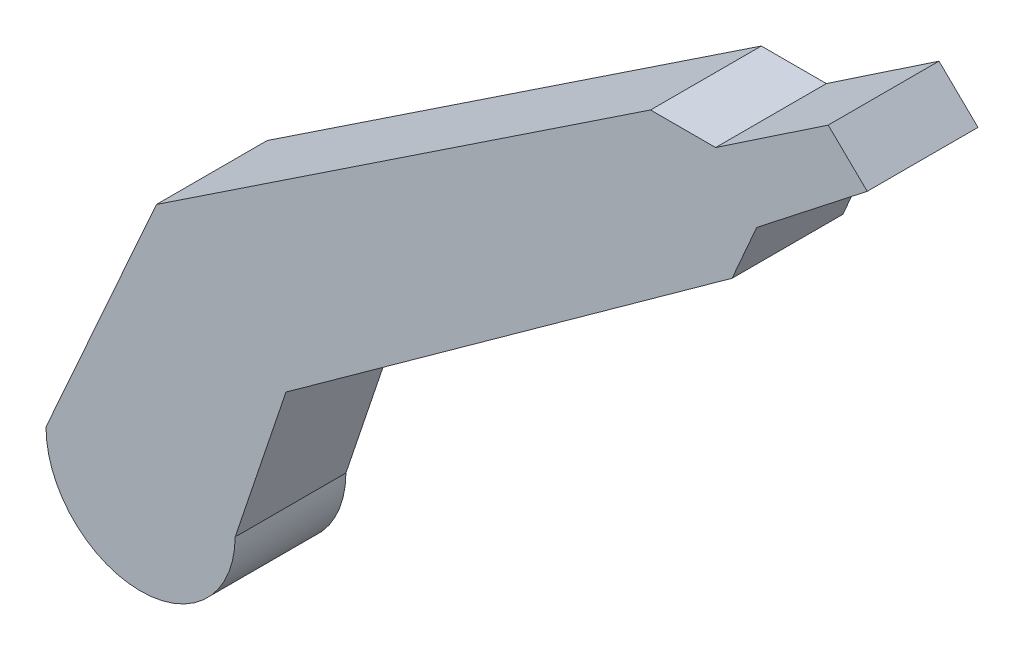
ISO-10303-21;
HEADER;
FILE_DESCRIPTION(('STEP AP214'),'2;1');
FILE_NAME('part.step','',(''),(''),'','','');
FILE_SCHEMA(('AUTOMOTIVE_DESIGN { 1 0 10303 214 1 1 1 1 }'));
ENDSEC;
DATA;
#1=APPLICATION_CONTEXT('core data for automotive mechanical design processes');
#2=APPLICATION_PROTOCOL_DEFINITION('international standard','automotive_design',2000,#1);
#3=PRODUCT_CONTEXT('',#1,'mechanical');
#4=PRODUCT('Part','Part','',(#3));
#5=PRODUCT_RELATED_PRODUCT_CATEGORY('part','',(#4));
#6=PRODUCT_DEFINITION_FORMATION('','',#4);
#7=PRODUCT_DEFINITION_CONTEXT('part definition',#1,'design');
#8=PRODUCT_DEFINITION('design','',#6,#7);
#9=PRODUCT_DEFINITION_SHAPE('','',#8);
#10=(LENGTH_UNIT() NAMED_UNIT(*) SI_UNIT(.MILLI.,.METRE.));
#11=(NAMED_UNIT(*) PLANE_ANGLE_UNIT() SI_UNIT($,.RADIAN.));
#12=(NAMED_UNIT(*) SI_UNIT($,.STERADIAN.) SOLID_ANGLE_UNIT());
#13=UNCERTAINTY_MEASURE_WITH_UNIT(LENGTH_MEASURE(1.E-05),#10,'distance_accuracy_value','');
#14=(GEOMETRIC_REPRESENTATION_CONTEXT(3) GLOBAL_UNCERTAINTY_ASSIGNED_CONTEXT((#13)) GLOBAL_UNIT_ASSIGNED_CONTEXT((#10,
#11,#12)) REPRESENTATION_CONTEXT('',''));
#15=CARTESIAN_POINT('',(0.,0.,0.));
#16=DIRECTION('',(0.,0.,1.));
#17=DIRECTION('',(1.,0.,0.));
#18=AXIS2_PLACEMENT_3D('',#15,#16,#17);
#19=CARTESIAN_POINT('',(-4.96700439876463,8.83577647212519,-15.));
#20=DIRECTION('',(0.,1.,0.));
#21=DIRECTION('',(0.,0.,1.));
#22=AXIS2_PLACEMENT_3D('',#19,#20,#21);
#23=PLANE('',#22);
#24=DIRECTION('',(-1.,0.,0.));
#25=VECTOR('',#24,1.);
#26=CARTESIAN_POINT('',(-4.96700439876463,8.83577647212519,0.));
#27=LINE('',#26,#25);
#28=CARTESIAN_POINT('',(3.84495684434683,8.83577647212519,0.));
#29=VERTEX_POINT('',#28);
#30=CARTESIAN_POINT('',(-4.96700439876463,8.83577647212519,0.));
#31=VERTEX_POINT('',#30);
#32=EDGE_CURVE('E152',#29,#31,#27,.T.);
#33=ORIENTED_EDGE('',*,*,#32,.F.);
#34=DIRECTION('',(0.,0.,1.));
#35=VECTOR('',#34,1.);
#36=CARTESIAN_POINT('',(3.84495684434683,8.83577647212519,-15.));
#37=LINE('',#36,#35);
#38=CARTESIAN_POINT('',(3.84495684434683,8.83577647212519,-15.));
#39=VERTEX_POINT('',#38);
#40=EDGE_CURVE('E11',#39,#29,#37,.T.);
#41=ORIENTED_EDGE('',*,*,#40,.F.);
#42=DIRECTION('',(-1.,0.,0.));
#43=VECTOR('',#42,1.);
#44=CARTESIAN_POINT('',(-4.96700439876463,8.83577647212519,-15.));
#45=LINE('',#44,#43);
#46=CARTESIAN_POINT('',(-4.96700439876463,8.83577647212519,-15.));
#47=VERTEX_POINT('',#46);
#48=EDGE_CURVE('E178',#39,#47,#45,.T.);
#49=ORIENTED_EDGE('',*,*,#48,.T.);
#50=DIRECTION('',(0.,0.,1.));
#51=VECTOR('',#50,1.);
#52=CARTESIAN_POINT('',(-4.96700439876463,8.83577647212519,-15.));
#53=LINE('',#52,#51);
#54=EDGE_CURVE('E46',#47,#31,#53,.T.);
#55=ORIENTED_EDGE('',*,*,#54,.T.);
#56=EDGE_LOOP('',(#33,#41,#49,#55));
#57=FACE_BOUND('',#56,.T.);
#58=ADVANCED_FACE('F43',(#57),#23,.T.);
#59=CARTESIAN_POINT('',(3.84495684434683,8.83577647212519,-15.));
#60=DIRECTION('',(-0.558142355295475,0.829745208618417,0.));
#61=DIRECTION('',(-0.829745208618417,-0.558142355295475,0.));
#62=AXIS2_PLACEMENT_3D('',#59,#60,#61);
#63=PLANE('',#62);
#64=DIRECTION('',(-0.829745208618417,-0.558142355295475,0.));
#65=VECTOR('',#64,1.);
#66=CARTESIAN_POINT('',(3.84495684434683,8.83577647212519,0.));
#67=LINE('',#66,#65);
#68=CARTESIAN_POINT('',(19.0918830920997,19.0918830920198,0.));
#69=VERTEX_POINT('',#68);
#70=EDGE_CURVE('E176',#69,#29,#67,.T.);
#71=ORIENTED_EDGE('',*,*,#70,.F.);
#72=DIRECTION('',(0.,0.,1.));
#73=VECTOR('',#72,1.);
#74=CARTESIAN_POINT('',(19.0918830920997,19.0918830920198,-15.));
#75=LINE('',#74,#73);
#76=CARTESIAN_POINT('',(19.0918830920997,19.0918830920198,-15.));
#77=VERTEX_POINT('',#76);
#78=EDGE_CURVE('E52',#77,#69,#75,.T.);
#79=ORIENTED_EDGE('',*,*,#78,.F.);
#80=DIRECTION('',(-0.829745208618417,-0.558142355295475,0.));
#81=VECTOR('',#80,1.);
#82=CARTESIAN_POINT('',(3.84495684434683,8.83577647212519,-15.));
#83=LINE('',#82,#81);
#84=EDGE_CURVE('E142',#77,#39,#83,.T.);
#85=ORIENTED_EDGE('',*,*,#84,.T.);
#86=ORIENTED_EDGE('',*,*,#40,.T.);
#87=EDGE_LOOP('',(#71,#79,#85,#86));
#88=FACE_BOUND('',#87,.T.);
#89=ADVANCED_FACE('F194',(#88),#63,.T.);
#90=CARTESIAN_POINT('',(19.0918830920997,19.0918830920198,-15.));
#91=DIRECTION('',(0.696355952916094,0.717696584106626,0.));
#92=DIRECTION('',(-0.717696584106626,0.696355952916094,0.));
#93=AXIS2_PLACEMENT_3D('',#90,#91,#92);
#94=PLANE('',#93);
#95=DIRECTION('',(-0.717696584106626,0.696355952916094,0.));
#96=VECTOR('',#95,1.);
#97=CARTESIAN_POINT('',(19.0918830920997,19.0918830920198,0.));
#98=LINE('',#97,#96);
#99=CARTESIAN_POINT('',(24.3770915092227,13.9638297820725,0.));
#100=VERTEX_POINT('',#99);
#101=EDGE_CURVE('E129',#100,#69,#98,.T.);
#102=ORIENTED_EDGE('',*,*,#101,.F.);
#103=DIRECTION('',(0.,0.,1.));
#104=VECTOR('',#103,1.);
#105=CARTESIAN_POINT('',(24.3770915092227,13.9638297820725,-15.));
#106=LINE('',#105,#104);
#107=CARTESIAN_POINT('',(24.3770915092227,13.9638297820725,-15.));
#108=VERTEX_POINT('',#107);
#109=EDGE_CURVE('E124',#108,#100,#106,.T.);
#110=ORIENTED_EDGE('',*,*,#109,.F.);
#111=DIRECTION('',(-0.717696584106626,0.696355952916094,0.));
#112=VECTOR('',#111,1.);
#113=CARTESIAN_POINT('',(19.0918830920997,19.0918830920198,-15.));
#114=LINE('',#113,#112);
#115=EDGE_CURVE('E127',#108,#77,#114,.T.);
#116=ORIENTED_EDGE('',*,*,#115,.T.);
#117=ORIENTED_EDGE('',*,*,#78,.T.);
#118=EDGE_LOOP('',(#102,#110,#116,#117));
#119=FACE_BOUND('',#118,.T.);
#120=ADVANCED_FACE('F126',(#119),#94,.T.);
#121=CARTESIAN_POINT('',(24.3770915092227,13.9638297820725,-15.));
#122=DIRECTION('',(0.616422868203892,-0.787415295479639,0.));
#123=DIRECTION('',(0.787415295479639,0.616422868203892,0.));
#124=AXIS2_PLACEMENT_3D('',#121,#122,#123);
#125=PLANE('',#124);
#126=DIRECTION('',(0.787415295479639,0.616422868203892,0.));
#127=VECTOR('',#126,1.);
#128=CARTESIAN_POINT('',(24.3770915092227,13.9638297820725,0.));
#129=LINE('',#128,#127);
#130=CARTESIAN_POINT('',(9.4079892103025,2.24536682293319,0.));
#131=VERTEX_POINT('',#130);
#132=EDGE_CURVE('E173',#131,#100,#129,.T.);
#133=ORIENTED_EDGE('',*,*,#132,.F.);
#134=DIRECTION('',(0.,0.,1.));
#135=VECTOR('',#134,1.);
#136=CARTESIAN_POINT('',(9.4079892103025,2.24536682293319,-15.));
#137=LINE('',#136,#135);
#138=CARTESIAN_POINT('',(9.4079892103025,2.24536682293319,-15.));
#139=VERTEX_POINT('',#138);
#140=EDGE_CURVE('E134',#139,#131,#137,.T.);
#141=ORIENTED_EDGE('',*,*,#140,.F.);
#142=DIRECTION('',(0.787415295479639,0.616422868203892,0.));
#143=VECTOR('',#142,1.);
#144=CARTESIAN_POINT('',(24.3770915092227,13.9638297820725,-15.));
#145=LINE('',#144,#143);
#146=EDGE_CURVE('E140',#139,#108,#145,.T.);
#147=ORIENTED_EDGE('',*,*,#146,.T.);
#148=ORIENTED_EDGE('',*,*,#109,.T.);
#149=EDGE_LOOP('',(#133,#141,#147,#148));
#150=FACE_BOUND('',#149,.T.);
#151=ADVANCED_FACE('F144',(#150),#125,.T.);
#152=CARTESIAN_POINT('',(9.4079892103025,2.24536682293319,-15.));
#153=DIRECTION('',(0.916458991132979,-0.400128626283502,0.));
#154=DIRECTION('',(0.400128626283502,0.916458991132979,0.));
#155=AXIS2_PLACEMENT_3D('',#152,#153,#154);
#156=PLANE('',#155);
#157=DIRECTION('',(0.400128626283502,0.916458991132979,0.));
#158=VECTOR('',#157,1.);
#159=CARTESIAN_POINT('',(9.4079892103025,2.24536682293319,0.));
#160=LINE('',#159,#158);
#161=CARTESIAN_POINT('',(6.0777600064057,-5.38222664567911,0.));
#162=VERTEX_POINT('',#161);
#163=EDGE_CURVE('E170',#162,#131,#160,.T.);
#164=ORIENTED_EDGE('',*,*,#163,.F.);
#165=DIRECTION('',(0.,0.,1.));
#166=VECTOR('',#165,1.);
#167=CARTESIAN_POINT('',(6.0777600064057,-5.38222664567911,-15.));
#168=LINE('',#167,#166);
#169=CARTESIAN_POINT('',(6.0777600064057,-5.38222664567911,-15.));
#170=VERTEX_POINT('',#169);
#171=EDGE_CURVE('E182',#170,#162,#168,.T.);
#172=ORIENTED_EDGE('',*,*,#171,.F.);
#173=DIRECTION('',(0.400128626283502,0.916458991132979,0.));
#174=VECTOR('',#173,1.);
#175=CARTESIAN_POINT('',(9.4079892103025,2.24536682293319,-15.));
#176=LINE('',#175,#174);
#177=EDGE_CURVE('E145',#170,#139,#176,.T.);
#178=ORIENTED_EDGE('',*,*,#177,.T.);
#179=ORIENTED_EDGE('',*,*,#140,.T.);
#180=EDGE_LOOP('',(#164,#172,#178,#179));
#181=FACE_BOUND('',#180,.T.);
#182=ADVANCED_FACE('F207',(#181),#156,.T.);
#183=CARTESIAN_POINT('',(6.0777600064057,-5.38222664567911,-15.));
#184=DIRECTION('',(0.584776246688422,-0.811194638363076,0.));
#185=DIRECTION('',(0.811194638363076,0.584776246688422,0.));
#186=AXIS2_PLACEMENT_3D('',#183,#184,#185);
#187=PLANE('',#186);
#188=DIRECTION('',(0.811194638363076,0.584776246688422,0.));
#189=VECTOR('',#188,1.);
#190=CARTESIAN_POINT('',(6.0777600064057,-5.38222664567911,0.));
#191=LINE('',#190,#189);
#192=CARTESIAN_POINT('',(-54.3403592021819,-48.9366084326035,0.));
#193=VERTEX_POINT('',#192);
#194=EDGE_CURVE('E167',#193,#162,#191,.T.);
#195=ORIENTED_EDGE('',*,*,#194,.F.);
#196=DIRECTION('',(0.,0.,1.));
#197=VECTOR('',#196,1.);
#198=CARTESIAN_POINT('',(-54.3403592021819,-48.9366084326035,-15.));
#199=LINE('',#198,#197);
#200=CARTESIAN_POINT('',(-54.3403592021819,-48.9366084326035,-15.));
#201=VERTEX_POINT('',#200);
#202=EDGE_CURVE('E184',#201,#193,#199,.T.);
#203=ORIENTED_EDGE('',*,*,#202,.F.);
#204=DIRECTION('',(0.811194638363076,0.584776246688422,0.));
#205=VECTOR('',#204,1.);
#206=CARTESIAN_POINT('',(6.0777600064057,-5.38222664567911,-15.));
#207=LINE('',#206,#205);
#208=EDGE_CURVE('E147',#201,#170,#207,.T.);
#209=ORIENTED_EDGE('',*,*,#208,.T.);
#210=ORIENTED_EDGE('',*,*,#171,.T.);
#211=EDGE_LOOP('',(#195,#203,#209,#210));
#212=FACE_BOUND('',#211,.T.);
#213=ADVANCED_FACE('F210',(#212),#187,.T.);
#214=CARTESIAN_POINT('',(-54.3403592021819,-48.9366084326035,-15.));
#215=DIRECTION('',(0.947729391455497,-0.319075227135221,0.));
#216=DIRECTION('',(0.319075227135221,0.947729391455497,0.));
#217=AXIS2_PLACEMENT_3D('',#214,#215,#216);
#218=PLANE('',#217);
#219=DIRECTION('',(0.319075227135221,0.947729391455497,0.));
#220=VECTOR('',#219,1.);
#221=CARTESIAN_POINT('',(-54.3403592021819,-48.9366084326035,0.));
#222=LINE('',#221,#220);
#223=CARTESIAN_POINT('',(-61.2186472889356,-69.3667616639981,0.));
#224=VERTEX_POINT('',#223);
#225=EDGE_CURVE('E164',#224,#193,#222,.T.);
#226=ORIENTED_EDGE('',*,*,#225,.F.);
#227=DIRECTION('',(0.,0.,1.));
#228=VECTOR('',#227,1.);
#229=CARTESIAN_POINT('',(-61.2186472889356,-69.3667616639981,-15.));
#230=LINE('',#229,#228);
#231=CARTESIAN_POINT('',(-61.2186472889356,-69.3667616639981,-15.));
#232=VERTEX_POINT('',#231);
#233=EDGE_CURVE('E186',#232,#224,#230,.T.);
#234=ORIENTED_EDGE('',*,*,#233,.F.);
#235=DIRECTION('',(0.319075227135221,0.947729391455497,0.));
#236=VECTOR('',#235,1.);
#237=CARTESIAN_POINT('',(-54.3403592021819,-48.9366084326035,-15.));
#238=LINE('',#237,#236);
#239=EDGE_CURVE('E309',#232,#201,#238,.T.);
#240=ORIENTED_EDGE('',*,*,#239,.T.);
#241=ORIENTED_EDGE('',*,*,#202,.T.);
#242=EDGE_LOOP('',(#226,#234,#240,#241));
#243=FACE_BOUND('',#242,.T.);
#244=ADVANCED_FACE('F214',(#243),#218,.T.);
#245=CARTESIAN_POINT('',(-74.0261196075807,-69.3140261854595,-15.));
#246=DIRECTION('',(0.,0.,1.));
#247=DIRECTION('',(1.,0.,0.));
#248=AXIS2_PLACEMENT_3D('',#245,#246,#247);
#249=CYLINDRICAL_SURFACE('',#248,12.8075808888157);
#250=CARTESIAN_POINT('',(-74.0261196075807,-69.3140261854595,0.));
#251=DIRECTION('',(0.,0.,1.));
#252=DIRECTION('',(1.,0.,0.));
#253=AXIS2_PLACEMENT_3D('',#250,#251,#252);
#254=CIRCLE('',#253,12.8075808888157);
#255=CARTESIAN_POINT('',(-86.8335919262258,-69.2612907069208,0.));
#256=VERTEX_POINT('',#255);
#257=EDGE_CURVE('E161',#256,#224,#254,.T.);
#258=ORIENTED_EDGE('',*,*,#257,.F.);
#259=DIRECTION('',(0.,0.,1.));
#260=VECTOR('',#259,1.);
#261=CARTESIAN_POINT('',(-86.8335919262258,-69.2612907069208,-15.));
#262=LINE('',#261,#260);
#263=CARTESIAN_POINT('',(-86.8335919262258,-69.2612907069208,-15.));
#264=VERTEX_POINT('',#263);
#265=EDGE_CURVE('E188',#264,#256,#262,.T.);
#266=ORIENTED_EDGE('',*,*,#265,.F.);
#267=CARTESIAN_POINT('',(-74.0261196075807,-69.3140261854595,-15.));
#268=DIRECTION('',(0.,0.,1.));
#269=DIRECTION('',(1.,0.,0.));
#270=AXIS2_PLACEMENT_3D('',#267,#268,#269);
#271=CIRCLE('',#270,12.8075808888157);
#272=EDGE_CURVE('E305',#264,#232,#271,.T.);
#273=ORIENTED_EDGE('',*,*,#272,.T.);
#274=ORIENTED_EDGE('',*,*,#233,.T.);
#275=EDGE_LOOP('',(#258,#266,#273,#274));
#276=FACE_BOUND('',#275,.T.);
#277=ADVANCED_FACE('F218',(#276),#249,.T.);
#278=CARTESIAN_POINT('',(-71.8849520293432,-35.7071985875734,-15.));
#279=DIRECTION('',(-0.913450392722276,0.406950095264173,0.));
#280=DIRECTION('',(-0.406950095264173,-0.913450392722276,0.));
#281=AXIS2_PLACEMENT_3D('',#278,#279,#280);
#282=PLANE('',#281);
#283=DIRECTION('',(-0.406950095264173,-0.913450392722276,0.));
#284=VECTOR('',#283,1.);
#285=CARTESIAN_POINT('',(-71.8849520293432,-35.7071985875734,0.));
#286=LINE('',#285,#284);
#287=CARTESIAN_POINT('',(-71.8849520293432,-35.7071985875734,0.));
#288=VERTEX_POINT('',#287);
#289=EDGE_CURVE('E158',#288,#256,#286,.T.);
#290=ORIENTED_EDGE('',*,*,#289,.F.);
#291=DIRECTION('',(0.,0.,1.));
#292=VECTOR('',#291,1.);
#293=CARTESIAN_POINT('',(-71.8849520293432,-35.7071985875734,-15.));
#294=LINE('',#293,#292);
#295=CARTESIAN_POINT('',(-71.8849520293432,-35.7071985875734,-15.));
#296=VERTEX_POINT('',#295);
#297=EDGE_CURVE('E189',#296,#288,#294,.T.);
#298=ORIENTED_EDGE('',*,*,#297,.F.);
#299=DIRECTION('',(-0.406950095264173,-0.913450392722276,0.));
#300=VECTOR('',#299,1.);
#301=CARTESIAN_POINT('',(-71.8849520293432,-35.7071985875734,-15.));
#302=LINE('',#301,#300);
#303=EDGE_CURVE('E316',#296,#264,#302,.T.);
#304=ORIENTED_EDGE('',*,*,#303,.T.);
#305=ORIENTED_EDGE('',*,*,#265,.T.);
#306=EDGE_LOOP('',(#290,#298,#304,#305));
#307=FACE_BOUND('',#306,.T.);
#308=ADVANCED_FACE('F222',(#307),#282,.T.);
#309=CARTESIAN_POINT('',(-4.96700439876463,8.83577647212519,-15.));
#310=DIRECTION('',(-0.554105900794991,0.832446184869732,0.));
#311=DIRECTION('',(-0.832446184869732,-0.554105900794991,0.));
#312=AXIS2_PLACEMENT_3D('',#309,#310,#311);
#313=PLANE('',#312);
#314=DIRECTION('',(-0.832446184869732,-0.554105900794991,0.));
#315=VECTOR('',#314,1.);
#316=CARTESIAN_POINT('',(-4.96700439876463,8.83577647212519,0.));
#317=LINE('',#316,#315);
#318=EDGE_CURVE('E155',#31,#288,#317,.T.);
#319=ORIENTED_EDGE('',*,*,#318,.F.);
#320=ORIENTED_EDGE('',*,*,#54,.F.);
#321=DIRECTION('',(-0.832446184869732,-0.554105900794991,0.));
#322=VECTOR('',#321,1.);
#323=CARTESIAN_POINT('',(-4.96700439876463,8.83577647212519,-15.));
#324=LINE('',#323,#322);
#325=EDGE_CURVE('E318',#47,#296,#324,.T.);
#326=ORIENTED_EDGE('',*,*,#325,.T.);
#327=ORIENTED_EDGE('',*,*,#297,.T.);
#328=EDGE_LOOP('',(#319,#320,#326,#327));
#329=FACE_BOUND('',#328,.T.);
#330=ADVANCED_FACE('F191',(#329),#313,.T.);
#331=CARTESIAN_POINT('',(-74.0261196075807,-69.3140261854595,-15.));
#332=DIRECTION('',(0.,0.,1.));
#333=DIRECTION('',(1.,0.,0.));
#334=AXIS2_PLACEMENT_3D('',#331,#332,#333);
#335=PLANE('',#334);
#336=ORIENTED_EDGE('',*,*,#48,.F.);
#337=ORIENTED_EDGE('',*,*,#84,.F.);
#338=ORIENTED_EDGE('',*,*,#115,.F.);
#339=ORIENTED_EDGE('',*,*,#146,.F.);
#340=ORIENTED_EDGE('',*,*,#177,.F.);
#341=ORIENTED_EDGE('',*,*,#208,.F.);
#342=ORIENTED_EDGE('',*,*,#239,.F.);
#343=ORIENTED_EDGE('',*,*,#272,.F.);
#344=ORIENTED_EDGE('',*,*,#303,.F.);
#345=ORIENTED_EDGE('',*,*,#325,.F.);
#346=EDGE_LOOP('',(#336,#337,#338,#339,#340,#341,#342,#343,#344,#345));
#347=FACE_BOUND('',#346,.T.);
#348=ADVANCED_FACE('F138',(#347),#335,.F.);
#349=CARTESIAN_POINT('',(-74.0261196075807,-69.3140261854595,0.));
#350=DIRECTION('',(0.,0.,1.));
#351=DIRECTION('',(1.,0.,0.));
#352=AXIS2_PLACEMENT_3D('',#349,#350,#351);
#353=PLANE('',#352);
#354=ORIENTED_EDGE('',*,*,#32,.T.);
#355=ORIENTED_EDGE('',*,*,#318,.T.);
#356=ORIENTED_EDGE('',*,*,#289,.T.);
#357=ORIENTED_EDGE('',*,*,#257,.T.);
#358=ORIENTED_EDGE('',*,*,#225,.T.);
#359=ORIENTED_EDGE('',*,*,#194,.T.);
#360=ORIENTED_EDGE('',*,*,#163,.T.);
#361=ORIENTED_EDGE('',*,*,#132,.T.);
#362=ORIENTED_EDGE('',*,*,#101,.T.);
#363=ORIENTED_EDGE('',*,*,#70,.T.);
#364=EDGE_LOOP('',(#354,#355,#356,#357,#358,#359,#360,#361,#362,#363));
#365=FACE_BOUND('',#364,.T.);
#366=ADVANCED_FACE('F193',(#365),#353,.T.);
#367=CLOSED_SHELL('',(#58,#89,#120,#151,#182,#213,#244,#277,#308,#330,#348,#366));
#368=MANIFOLD_SOLID_BREP('B2',#367);
#369=ADVANCED_BREP_SHAPE_REPRESENTATION('',(#18,#368),#14);
#370=SHAPE_DEFINITION_REPRESENTATION(#9,#369);
ENDSEC;
END-ISO-10303-21;
